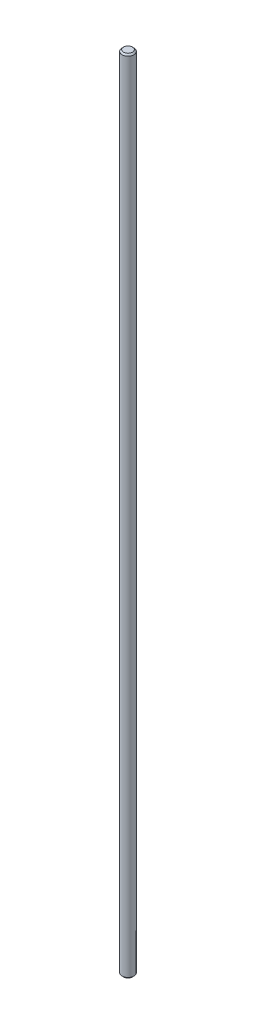
ISO-10303-21;
HEADER;
FILE_DESCRIPTION(('STEP AP214'),'2;1');
FILE_NAME('part.step','',(''),(''),'','','');
FILE_SCHEMA(('AUTOMOTIVE_DESIGN { 1 0 10303 214 1 1 1 1 }'));
ENDSEC;
DATA;
#1=APPLICATION_CONTEXT('core data for automotive mechanical design processes');
#2=APPLICATION_PROTOCOL_DEFINITION('international standard','automotive_design',2000,#1);
#3=PRODUCT_CONTEXT('',#1,'mechanical');
#4=PRODUCT('Part','Part','',(#3));
#5=PRODUCT_RELATED_PRODUCT_CATEGORY('part','',(#4));
#6=PRODUCT_DEFINITION_FORMATION('','',#4);
#7=PRODUCT_DEFINITION_CONTEXT('part definition',#1,'design');
#8=PRODUCT_DEFINITION('design','',#6,#7);
#9=PRODUCT_DEFINITION_SHAPE('','',#8);
#10=(LENGTH_UNIT() NAMED_UNIT(*) SI_UNIT(.MILLI.,.METRE.));
#11=(NAMED_UNIT(*) PLANE_ANGLE_UNIT() SI_UNIT($,.RADIAN.));
#12=(NAMED_UNIT(*) SI_UNIT($,.STERADIAN.) SOLID_ANGLE_UNIT());
#13=UNCERTAINTY_MEASURE_WITH_UNIT(LENGTH_MEASURE(1.E-05),#10,'distance_accuracy_value','');
#14=(GEOMETRIC_REPRESENTATION_CONTEXT(3) GLOBAL_UNCERTAINTY_ASSIGNED_CONTEXT((#13)) GLOBAL_UNIT_ASSIGNED_CONTEXT((#10,
#11,#12)) REPRESENTATION_CONTEXT('',''));
#15=CARTESIAN_POINT('',(0.,0.,0.));
#16=DIRECTION('',(0.,0.,1.));
#17=DIRECTION('',(1.,0.,0.));
#18=AXIS2_PLACEMENT_3D('',#15,#16,#17);
#19=CARTESIAN_POINT('',(0.,135.,0.));
#20=DIRECTION('',(0.,-1.,0.));
#21=DIRECTION('',(0.,0.,-1.));
#22=AXIS2_PLACEMENT_3D('',#19,#20,#21);
#23=CYLINDRICAL_SURFACE('',#22,2.);
#24=CARTESIAN_POINT('',(0.,-134.5,0.));
#25=DIRECTION('',(0.,1.,0.));
#26=DIRECTION('',(0.,0.,1.));
#27=AXIS2_PLACEMENT_3D('',#24,#25,#26);
#28=CIRCLE('',#27,2.);
#29=CARTESIAN_POINT('',(0.,-134.5,2.));
#30=VERTEX_POINT('',#29);
#31=EDGE_CURVE('E44',#30,#30,#28,.T.);
#32=ORIENTED_EDGE('',*,*,#31,.T.);
#33=EDGE_LOOP('',(#32));
#34=FACE_BOUND('',#33,.T.);
#35=CARTESIAN_POINT('',(0.,134.5,0.));
#36=DIRECTION('',(0.,1.,0.));
#37=DIRECTION('',(0.,0.,1.));
#38=AXIS2_PLACEMENT_3D('',#35,#36,#37);
#39=CIRCLE('',#38,2.);
#40=CARTESIAN_POINT('',(0.,134.5,2.));
#41=VERTEX_POINT('',#40);
#42=EDGE_CURVE('E48',#41,#41,#39,.F.);
#43=ORIENTED_EDGE('',*,*,#42,.T.);
#44=EDGE_LOOP('',(#43));
#45=FACE_BOUND('',#44,.T.);
#46=ADVANCED_FACE('F32',(#34,#45),#23,.T.);
#47=CARTESIAN_POINT('',(0.,135.,0.));
#48=DIRECTION('',(0.,1.,0.));
#49=DIRECTION('',(0.,0.,1.));
#50=AXIS2_PLACEMENT_3D('',#47,#48,#49);
#51=PLANE('',#50);
#52=CARTESIAN_POINT('',(0.,135.,0.));
#53=DIRECTION('',(0.,1.,0.));
#54=DIRECTION('',(0.,0.,1.));
#55=AXIS2_PLACEMENT_3D('',#52,#53,#54);
#56=CIRCLE('',#55,1.5);
#57=CARTESIAN_POINT('',(0.,135.,1.5));
#58=VERTEX_POINT('',#57);
#59=EDGE_CURVE('E10',#58,#58,#56,.T.);
#60=ORIENTED_EDGE('',*,*,#59,.T.);
#61=EDGE_LOOP('',(#60));
#62=FACE_BOUND('',#61,.T.);
#63=ADVANCED_FACE('F64',(#62),#51,.T.);
#64=CARTESIAN_POINT('',(0.,-135.,0.));
#65=DIRECTION('',(0.,1.,0.));
#66=DIRECTION('',(0.,0.,1.));
#67=AXIS2_PLACEMENT_3D('',#64,#65,#66);
#68=PLANE('',#67);
#69=CARTESIAN_POINT('',(0.,-135.,0.));
#70=DIRECTION('',(0.,1.,0.));
#71=DIRECTION('',(0.,0.,1.));
#72=AXIS2_PLACEMENT_3D('',#69,#70,#71);
#73=CIRCLE('',#72,1.50000000000006);
#74=CARTESIAN_POINT('',(0.,-135.,1.50000000000006));
#75=VERTEX_POINT('',#74);
#76=EDGE_CURVE('E40',#75,#75,#73,.F.);
#77=ORIENTED_EDGE('',*,*,#76,.T.);
#78=EDGE_LOOP('',(#77));
#79=FACE_BOUND('',#78,.T.);
#80=ADVANCED_FACE('F61',(#79),#68,.F.);
#81=CARTESIAN_POINT('',(0.,-134.5,0.));
#82=DIRECTION('',(0.,1.,0.));
#83=DIRECTION('',(0.,0.,1.));
#84=AXIS2_PLACEMENT_3D('',#81,#82,#83);
#85=CONICAL_SURFACE('',#84,2.,0.785398163397447);
#86=ORIENTED_EDGE('',*,*,#76,.F.);
#87=EDGE_LOOP('',(#86));
#88=FACE_BOUND('',#87,.T.);
#89=ORIENTED_EDGE('',*,*,#31,.F.);
#90=EDGE_LOOP('',(#89));
#91=FACE_BOUND('',#90,.T.);
#92=ADVANCED_FACE('F57',(#88,#91),#85,.T.);
#93=CARTESIAN_POINT('',(0.,135.,0.));
#94=DIRECTION('',(0.,-1.,0.));
#95=DIRECTION('',(0.,0.,-1.));
#96=AXIS2_PLACEMENT_3D('',#93,#94,#95);
#97=CONICAL_SURFACE('',#96,1.5,0.785398163397447);
#98=ORIENTED_EDGE('',*,*,#42,.F.);
#99=EDGE_LOOP('',(#98));
#100=FACE_BOUND('',#99,.T.);
#101=ORIENTED_EDGE('',*,*,#59,.F.);
#102=EDGE_LOOP('',(#101));
#103=FACE_BOUND('',#102,.T.);
#104=ADVANCED_FACE('F35',(#100,#103),#97,.T.);
#105=CLOSED_SHELL('',(#46,#63,#80,#92,#104));
#106=MANIFOLD_SOLID_BREP('B2',#105);
#107=ADVANCED_BREP_SHAPE_REPRESENTATION('',(#18,#106),#14);
#108=SHAPE_DEFINITION_REPRESENTATION(#9,#107);
ENDSEC;
END-ISO-10303-21;
